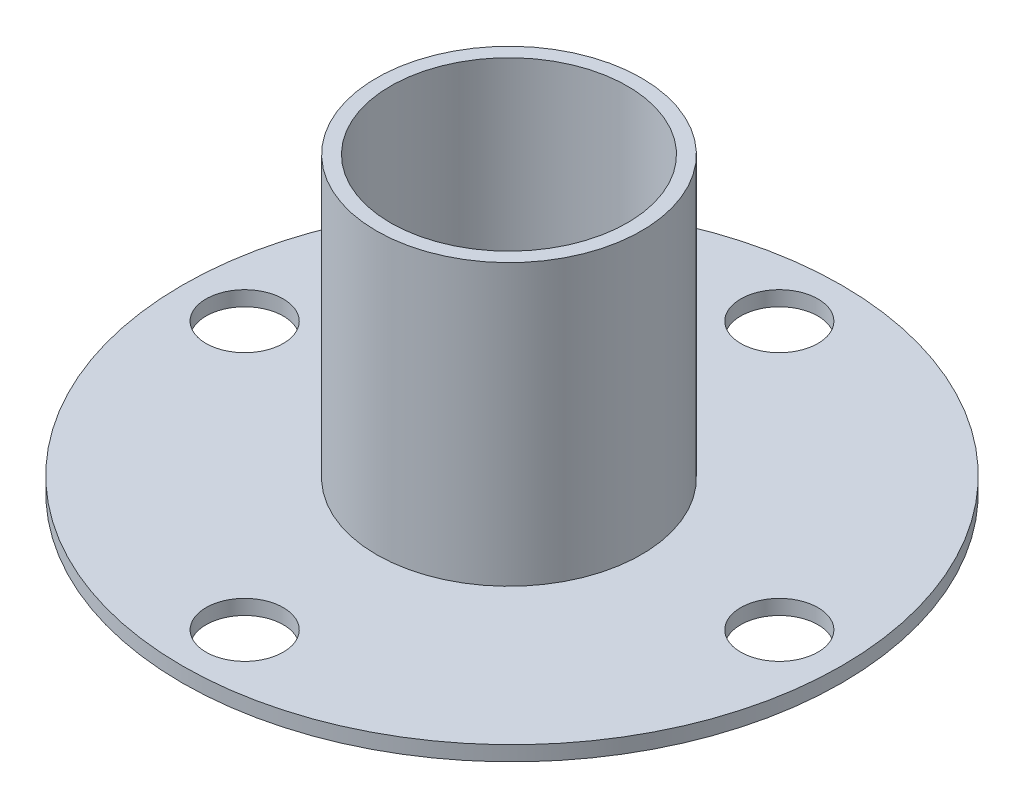
ISO-10303-21;
HEADER;
FILE_DESCRIPTION(('STEP AP214'),'2;1');
FILE_NAME('part.step','',(''),(''),'','','');
FILE_SCHEMA(('AUTOMOTIVE_DESIGN { 1 0 10303 214 1 1 1 1 }'));
ENDSEC;
DATA;
#1=APPLICATION_CONTEXT('core data for automotive mechanical design processes');
#2=APPLICATION_PROTOCOL_DEFINITION('international standard','automotive_design',2000,#1);
#3=PRODUCT_CONTEXT('',#1,'mechanical');
#4=PRODUCT('Part','Part','',(#3));
#5=PRODUCT_RELATED_PRODUCT_CATEGORY('part','',(#4));
#6=PRODUCT_DEFINITION_FORMATION('','',#4);
#7=PRODUCT_DEFINITION_CONTEXT('part definition',#1,'design');
#8=PRODUCT_DEFINITION('design','',#6,#7);
#9=PRODUCT_DEFINITION_SHAPE('','',#8);
#10=(LENGTH_UNIT() NAMED_UNIT(*) SI_UNIT(.MILLI.,.METRE.));
#11=(NAMED_UNIT(*) PLANE_ANGLE_UNIT() SI_UNIT($,.RADIAN.));
#12=(NAMED_UNIT(*) SI_UNIT($,.STERADIAN.) SOLID_ANGLE_UNIT());
#13=UNCERTAINTY_MEASURE_WITH_UNIT(LENGTH_MEASURE(1.E-05),#10,'distance_accuracy_value','');
#14=(GEOMETRIC_REPRESENTATION_CONTEXT(3) GLOBAL_UNCERTAINTY_ASSIGNED_CONTEXT((#13)) GLOBAL_UNIT_ASSIGNED_CONTEXT((#10,
#11,#12)) REPRESENTATION_CONTEXT('',''));
#15=CARTESIAN_POINT('',(0.,0.,0.));
#16=DIRECTION('',(0.,0.,1.));
#17=DIRECTION('',(1.,0.,0.));
#18=AXIS2_PLACEMENT_3D('',#15,#16,#17);
#19=CARTESIAN_POINT('',(9.47475886610459,44.,4.58072204495095));
#20=DIRECTION('',(0.,1.,0.));
#21=DIRECTION('',(0.,0.,1.));
#22=AXIS2_PLACEMENT_3D('',#19,#20,#21);
#23=PLANE('',#22);
#24=CARTESIAN_POINT('',(9.52453165487508,44.,4.83420849198722));
#25=DIRECTION('',(0.,1.,0.));
#26=DIRECTION('',(0.,0.,1.));
#27=AXIS2_PLACEMENT_3D('',#24,#25,#26);
#28=CIRCLE('',#27,6.91436631463015);
#29=CARTESIAN_POINT('',(9.52453165487508,44.,11.7485748066174));
#30=VERTEX_POINT('',#29);
#31=EDGE_CURVE('E66',#30,#30,#28,.T.);
#32=ORIENTED_EDGE('',*,*,#31,.T.);
#33=EDGE_LOOP('',(#32));
#34=FACE_BOUND('',#33,.T.);
#35=CARTESIAN_POINT('',(9.47475886610458,44.,-13.419277955049));
#36=DIRECTION('',(0.,1.,0.));
#37=DIRECTION('',(0.,0.,1.));
#38=AXIS2_PLACEMENT_3D('',#35,#36,#37);
#39=CIRCLE('',#38,2.6);
#40=CARTESIAN_POINT('',(9.47475886610458,44.,-10.819277955049));
#41=VERTEX_POINT('',#40);
#42=EDGE_CURVE('E59',#41,#41,#39,.T.);
#43=ORIENTED_EDGE('',*,*,#42,.T.);
#44=EDGE_LOOP('',(#43));
#45=FACE_BOUND('',#44,.T.);
#46=CARTESIAN_POINT('',(27.4747588661046,44.,4.58072204495095));
#47=DIRECTION('',(0.,1.,0.));
#48=DIRECTION('',(0.,0.,1.));
#49=AXIS2_PLACEMENT_3D('',#46,#47,#48);
#50=CIRCLE('',#49,2.6);
#51=CARTESIAN_POINT('',(27.4747588661046,44.,7.18072204495095));
#52=VERTEX_POINT('',#51);
#53=EDGE_CURVE('E78',#52,#52,#50,.T.);
#54=ORIENTED_EDGE('',*,*,#53,.T.);
#55=EDGE_LOOP('',(#54));
#56=FACE_BOUND('',#55,.T.);
#57=CARTESIAN_POINT('',(9.47475886610459,44.,22.5807220449509));
#58=DIRECTION('',(0.,1.,0.));
#59=DIRECTION('',(0.,0.,1.));
#60=AXIS2_PLACEMENT_3D('',#57,#58,#59);
#61=CIRCLE('',#60,2.6);
#62=CARTESIAN_POINT('',(9.47475886610459,44.,25.180722044951));
#63=VERTEX_POINT('',#62);
#64=EDGE_CURVE('E70',#63,#63,#61,.T.);
#65=ORIENTED_EDGE('',*,*,#64,.T.);
#66=EDGE_LOOP('',(#65));
#67=FACE_BOUND('',#66,.T.);
#68=CARTESIAN_POINT('',(-8.52524113389541,44.,4.58072204495095));
#69=DIRECTION('',(0.,1.,0.));
#70=DIRECTION('',(0.,0.,1.));
#71=AXIS2_PLACEMENT_3D('',#68,#69,#70);
#72=CIRCLE('',#71,2.6);
#73=CARTESIAN_POINT('',(-8.52524113389541,44.,7.18072204495096));
#74=VERTEX_POINT('',#73);
#75=EDGE_CURVE('E61',#74,#74,#72,.T.);
#76=ORIENTED_EDGE('',*,*,#75,.T.);
#77=EDGE_LOOP('',(#76));
#78=FACE_BOUND('',#77,.T.);
#79=CARTESIAN_POINT('',(9.47475886610459,44.,4.58072204495095));
#80=DIRECTION('',(0.,1.,0.));
#81=DIRECTION('',(0.,0.,1.));
#82=AXIS2_PLACEMENT_3D('',#79,#80,#81);
#83=CIRCLE('',#82,22.2);
#84=CARTESIAN_POINT('',(9.47475886610459,44.,26.780722044951));
#85=VERTEX_POINT('',#84);
#86=EDGE_CURVE('E11',#85,#85,#83,.T.);
#87=ORIENTED_EDGE('',*,*,#86,.F.);
#88=EDGE_LOOP('',(#87));
#89=FACE_BOUND('',#88,.T.);
#90=ADVANCED_FACE('F46',(#34,#45,#56,#67,#78,#89),#23,.F.);
#91=CARTESIAN_POINT('',(9.47475886610459,45.,4.58072204495095));
#92=DIRECTION('',(0.,1.,0.));
#93=DIRECTION('',(0.,0.,1.));
#94=AXIS2_PLACEMENT_3D('',#91,#92,#93);
#95=PLANE('',#94);
#96=CARTESIAN_POINT('',(9.52453165487508,45.,4.83420849198722));
#97=DIRECTION('',(0.,1.,0.));
#98=DIRECTION('',(0.,0.,1.));
#99=AXIS2_PLACEMENT_3D('',#96,#97,#98);
#100=CIRCLE('',#99,8.92257088604587);
#101=CARTESIAN_POINT('',(9.52453165487508,45.,13.7567793780331));
#102=VERTEX_POINT('',#101);
#103=EDGE_CURVE('E96',#102,#102,#100,.T.);
#104=ORIENTED_EDGE('',*,*,#103,.F.);
#105=EDGE_LOOP('',(#104));
#106=FACE_BOUND('',#105,.T.);
#107=CARTESIAN_POINT('',(9.47475886610458,45.,-13.419277955049));
#108=DIRECTION('',(0.,1.,0.));
#109=DIRECTION('',(0.,0.,1.));
#110=AXIS2_PLACEMENT_3D('',#107,#108,#109);
#111=CIRCLE('',#110,2.6);
#112=CARTESIAN_POINT('',(9.47475886610458,45.,-10.819277955049));
#113=VERTEX_POINT('',#112);
#114=EDGE_CURVE('E86',#113,#113,#111,.T.);
#115=ORIENTED_EDGE('',*,*,#114,.F.);
#116=EDGE_LOOP('',(#115));
#117=FACE_BOUND('',#116,.T.);
#118=CARTESIAN_POINT('',(27.4747588661046,45.,4.58072204495095));
#119=DIRECTION('',(0.,1.,0.));
#120=DIRECTION('',(0.,0.,1.));
#121=AXIS2_PLACEMENT_3D('',#118,#119,#120);
#122=CIRCLE('',#121,2.6);
#123=CARTESIAN_POINT('',(27.4747588661046,45.,7.18072204495095));
#124=VERTEX_POINT('',#123);
#125=EDGE_CURVE('E82',#124,#124,#122,.T.);
#126=ORIENTED_EDGE('',*,*,#125,.F.);
#127=EDGE_LOOP('',(#126));
#128=FACE_BOUND('',#127,.T.);
#129=CARTESIAN_POINT('',(9.47475886610459,45.,22.5807220449509));
#130=DIRECTION('',(0.,1.,0.));
#131=DIRECTION('',(0.,0.,1.));
#132=AXIS2_PLACEMENT_3D('',#129,#130,#131);
#133=CIRCLE('',#132,2.6);
#134=CARTESIAN_POINT('',(9.47475886610459,45.,25.180722044951));
#135=VERTEX_POINT('',#134);
#136=EDGE_CURVE('E74',#135,#135,#133,.T.);
#137=ORIENTED_EDGE('',*,*,#136,.F.);
#138=EDGE_LOOP('',(#137));
#139=FACE_BOUND('',#138,.T.);
#140=CARTESIAN_POINT('',(-8.52524113389541,45.,4.58072204495095));
#141=DIRECTION('',(0.,1.,0.));
#142=DIRECTION('',(0.,0.,1.));
#143=AXIS2_PLACEMENT_3D('',#140,#141,#142);
#144=CIRCLE('',#143,2.6);
#145=CARTESIAN_POINT('',(-8.52524113389541,45.,7.18072204495096));
#146=VERTEX_POINT('',#145);
#147=EDGE_CURVE('E65',#146,#146,#144,.T.);
#148=ORIENTED_EDGE('',*,*,#147,.F.);
#149=EDGE_LOOP('',(#148));
#150=FACE_BOUND('',#149,.T.);
#151=CARTESIAN_POINT('',(9.47475886610459,45.,4.58072204495095));
#152=DIRECTION('',(0.,1.,0.));
#153=DIRECTION('',(0.,0.,1.));
#154=AXIS2_PLACEMENT_3D('',#151,#152,#153);
#155=CIRCLE('',#154,22.2);
#156=CARTESIAN_POINT('',(9.47475886610459,45.,26.780722044951));
#157=VERTEX_POINT('',#156);
#158=EDGE_CURVE('E50',#157,#157,#155,.T.);
#159=ORIENTED_EDGE('',*,*,#158,.T.);
#160=EDGE_LOOP('',(#159));
#161=FACE_BOUND('',#160,.T.);
#162=ADVANCED_FACE('F131',(#106,#117,#128,#139,#150,#161),#95,.T.);
#163=CARTESIAN_POINT('',(9.47475886610459,44.,4.58072204495095));
#164=DIRECTION('',(0.,1.,0.));
#165=DIRECTION('',(0.,0.,1.));
#166=AXIS2_PLACEMENT_3D('',#163,#164,#165);
#167=CYLINDRICAL_SURFACE('',#166,22.2);
#168=ORIENTED_EDGE('',*,*,#86,.T.);
#169=EDGE_LOOP('',(#168));
#170=FACE_BOUND('',#169,.T.);
#171=ORIENTED_EDGE('',*,*,#158,.F.);
#172=EDGE_LOOP('',(#171));
#173=FACE_BOUND('',#172,.T.);
#174=ADVANCED_FACE('F48',(#170,#173),#167,.T.);
#175=CARTESIAN_POINT('',(-8.52524113389541,44.,4.58072204495095));
#176=DIRECTION('',(0.,1.,0.));
#177=DIRECTION('',(0.,0.,1.));
#178=AXIS2_PLACEMENT_3D('',#175,#176,#177);
#179=CYLINDRICAL_SURFACE('',#178,2.6);
#180=ORIENTED_EDGE('',*,*,#75,.F.);
#181=EDGE_LOOP('',(#180));
#182=FACE_BOUND('',#181,.T.);
#183=ORIENTED_EDGE('',*,*,#147,.T.);
#184=EDGE_LOOP('',(#183));
#185=FACE_BOUND('',#184,.T.);
#186=ADVANCED_FACE('F142',(#182,#185),#179,.F.);
#187=CARTESIAN_POINT('',(9.47475886610459,44.,22.5807220449509));
#188=DIRECTION('',(0.,1.,0.));
#189=DIRECTION('',(0.,0.,1.));
#190=AXIS2_PLACEMENT_3D('',#187,#188,#189);
#191=CYLINDRICAL_SURFACE('',#190,2.6);
#192=ORIENTED_EDGE('',*,*,#64,.F.);
#193=EDGE_LOOP('',(#192));
#194=FACE_BOUND('',#193,.T.);
#195=ORIENTED_EDGE('',*,*,#136,.T.);
#196=EDGE_LOOP('',(#195));
#197=FACE_BOUND('',#196,.T.);
#198=ADVANCED_FACE('F144',(#194,#197),#191,.F.);
#199=CARTESIAN_POINT('',(27.4747588661046,44.,4.58072204495095));
#200=DIRECTION('',(0.,1.,0.));
#201=DIRECTION('',(0.,0.,1.));
#202=AXIS2_PLACEMENT_3D('',#199,#200,#201);
#203=CYLINDRICAL_SURFACE('',#202,2.6);
#204=ORIENTED_EDGE('',*,*,#53,.F.);
#205=EDGE_LOOP('',(#204));
#206=FACE_BOUND('',#205,.T.);
#207=ORIENTED_EDGE('',*,*,#125,.T.);
#208=EDGE_LOOP('',(#207));
#209=FACE_BOUND('',#208,.T.);
#210=ADVANCED_FACE('F147',(#206,#209),#203,.F.);
#211=CARTESIAN_POINT('',(9.47475886610458,44.,-13.419277955049));
#212=DIRECTION('',(0.,1.,0.));
#213=DIRECTION('',(0.,0.,1.));
#214=AXIS2_PLACEMENT_3D('',#211,#212,#213);
#215=CYLINDRICAL_SURFACE('',#214,2.6);
#216=ORIENTED_EDGE('',*,*,#42,.F.);
#217=EDGE_LOOP('',(#216));
#218=FACE_BOUND('',#217,.T.);
#219=ORIENTED_EDGE('',*,*,#114,.T.);
#220=EDGE_LOOP('',(#219));
#221=FACE_BOUND('',#220,.T.);
#222=ADVANCED_FACE('F151',(#218,#221),#215,.F.);
#223=CARTESIAN_POINT('',(9.52453165487508,-4.99999821186066,4.83420849198722));
#224=DIRECTION('',(0.,1.,0.));
#225=DIRECTION('',(0.,0.,1.));
#226=AXIS2_PLACEMENT_3D('',#223,#224,#225);
#227=CYLINDRICAL_SURFACE('',#226,6.91436631463015);
#228=CARTESIAN_POINT('',(9.52453165487508,45.,4.83420849198722));
#229=DIRECTION('',(0.,1.,0.));
#230=DIRECTION('',(0.,0.,1.));
#231=AXIS2_PLACEMENT_3D('',#228,#229,#230);
#232=CIRCLE('',#231,6.91436631463015);
#233=CARTESIAN_POINT('',(9.52453165487508,45.,11.7485748066174));
#234=VERTEX_POINT('',#233);
#235=EDGE_CURVE('E97',#234,#234,#232,.F.);
#236=ORIENTED_EDGE('',*,*,#235,.F.);
#237=EDGE_LOOP('',(#236));
#238=FACE_BOUND('',#237,.T.);
#239=ORIENTED_EDGE('',*,*,#31,.F.);
#240=EDGE_LOOP('',(#239));
#241=FACE_BOUND('',#240,.T.);
#242=ADVANCED_FACE('F155',(#238,#241),#227,.F.);
#243=CARTESIAN_POINT('',(9.52453165487508,65.,4.83420849198722));
#244=DIRECTION('',(0.,-1.,0.));
#245=DIRECTION('',(0.,0.,-1.));
#246=AXIS2_PLACEMENT_3D('',#243,#244,#245);
#247=CYLINDRICAL_SURFACE('',#246,8.92257088604587);
#248=ORIENTED_EDGE('',*,*,#103,.T.);
#249=EDGE_LOOP('',(#248));
#250=FACE_BOUND('',#249,.T.);
#251=CARTESIAN_POINT('',(9.52453165487508,63.8736149049284,4.83420849198722));
#252=DIRECTION('',(0.,1.,0.));
#253=DIRECTION('',(0.,0.,1.));
#254=AXIS2_PLACEMENT_3D('',#251,#252,#253);
#255=CIRCLE('',#254,8.92257088604587);
#256=CARTESIAN_POINT('',(9.52453165487508,63.8736149049284,13.7567793780331));
#257=VERTEX_POINT('',#256);
#258=EDGE_CURVE('E108',#257,#257,#255,.T.);
#259=ORIENTED_EDGE('',*,*,#258,.F.);
#260=EDGE_LOOP('',(#259));
#261=FACE_BOUND('',#260,.T.);
#262=ADVANCED_FACE('F159',(#250,#261),#247,.T.);
#263=CARTESIAN_POINT('',(9.52453165487508,45.,4.83420849198722));
#264=DIRECTION('',(0.,1.,0.));
#265=DIRECTION('',(0.,0.,1.));
#266=AXIS2_PLACEMENT_3D('',#263,#264,#265);
#267=PLANE('',#266);
#268=CARTESIAN_POINT('',(9.52453165487508,45.,4.83420849198722));
#269=DIRECTION('',(0.,1.,0.));
#270=DIRECTION('',(0.,0.,1.));
#271=AXIS2_PLACEMENT_3D('',#268,#269,#270);
#272=CIRCLE('',#271,7.97880080659274);
#273=CARTESIAN_POINT('',(9.52453165487508,45.,12.81300929858));
#274=VERTEX_POINT('',#273);
#275=EDGE_CURVE('E101',#274,#274,#272,.T.);
#276=ORIENTED_EDGE('',*,*,#275,.T.);
#277=EDGE_LOOP('',(#276));
#278=FACE_BOUND('',#277,.T.);
#279=ORIENTED_EDGE('',*,*,#235,.T.);
#280=EDGE_LOOP('',(#279));
#281=FACE_BOUND('',#280,.T.);
#282=ADVANCED_FACE('F126',(#278,#281),#267,.T.);
#283=CARTESIAN_POINT('',(9.52453165487508,45.,4.83420849198722));
#284=DIRECTION('',(0.,1.,0.));
#285=DIRECTION('',(0.,0.,1.));
#286=AXIS2_PLACEMENT_3D('',#283,#284,#285);
#287=CYLINDRICAL_SURFACE('',#286,7.97880080659274);
#288=ORIENTED_EDGE('',*,*,#275,.F.);
#289=EDGE_LOOP('',(#288));
#290=FACE_BOUND('',#289,.T.);
#291=CARTESIAN_POINT('',(9.52453165487508,63.8736149049284,4.83420849198722));
#292=DIRECTION('',(0.,1.,0.));
#293=DIRECTION('',(0.,0.,1.));
#294=AXIS2_PLACEMENT_3D('',#291,#292,#293);
#295=CIRCLE('',#294,7.97880080659274);
#296=CARTESIAN_POINT('',(9.52453165487508,63.8736149049284,12.81300929858));
#297=VERTEX_POINT('',#296);
#298=EDGE_CURVE('E112',#297,#297,#295,.T.);
#299=ORIENTED_EDGE('',*,*,#298,.T.);
#300=EDGE_LOOP('',(#299));
#301=FACE_BOUND('',#300,.T.);
#302=ADVANCED_FACE('F117',(#290,#301),#287,.F.);
#303=CARTESIAN_POINT('',(9.52453165487508,63.8736149049284,4.83420849198722));
#304=DIRECTION('',(0.,1.,0.));
#305=DIRECTION('',(0.,0.,1.));
#306=AXIS2_PLACEMENT_3D('',#303,#304,#305);
#307=PLANE('',#306);
#308=ORIENTED_EDGE('',*,*,#258,.T.);
#309=EDGE_LOOP('',(#308));
#310=FACE_BOUND('',#309,.T.);
#311=ORIENTED_EDGE('',*,*,#298,.F.);
#312=EDGE_LOOP('',(#311));
#313=FACE_BOUND('',#312,.T.);
#314=ADVANCED_FACE('F119',(#310,#313),#307,.T.);
#315=CLOSED_SHELL('',(#90,#162,#174,#186,#198,#210,#222,#242,#262,#282,#302,#314));
#316=MANIFOLD_SOLID_BREP('B2',#315);
#317=ADVANCED_BREP_SHAPE_REPRESENTATION('',(#18,#316),#14);
#318=SHAPE_DEFINITION_REPRESENTATION(#9,#317);
ENDSEC;
END-ISO-10303-21;
